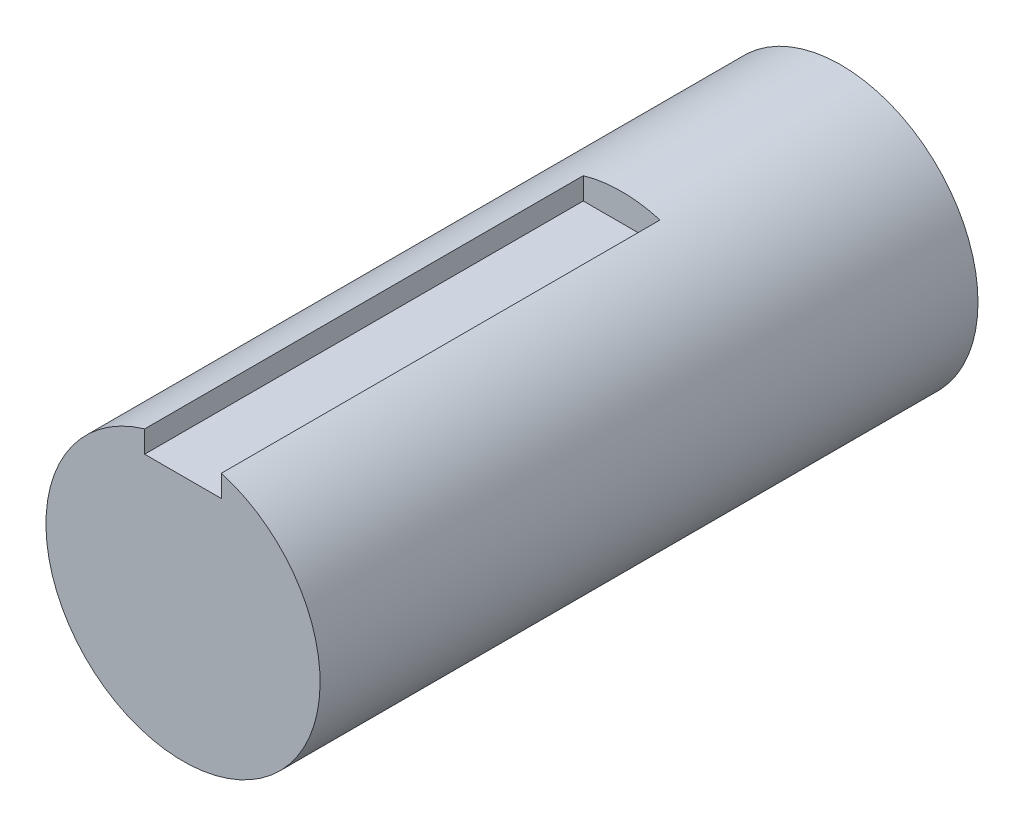
ISO-10303-21;
HEADER;
FILE_DESCRIPTION(('STEP AP214'),'2;1');
FILE_NAME('part.step','',(''),(''),'','','');
FILE_SCHEMA(('AUTOMOTIVE_DESIGN { 1 0 10303 214 1 1 1 1 }'));
ENDSEC;
DATA;
#1=APPLICATION_CONTEXT('core data for automotive mechanical design processes');
#2=APPLICATION_PROTOCOL_DEFINITION('international standard','automotive_design',2000,#1);
#3=PRODUCT_CONTEXT('',#1,'mechanical');
#4=PRODUCT('Part','Part','',(#3));
#5=PRODUCT_RELATED_PRODUCT_CATEGORY('part','',(#4));
#6=PRODUCT_DEFINITION_FORMATION('','',#4);
#7=PRODUCT_DEFINITION_CONTEXT('part definition',#1,'design');
#8=PRODUCT_DEFINITION('design','',#6,#7);
#9=PRODUCT_DEFINITION_SHAPE('','',#8);
#10=(LENGTH_UNIT() NAMED_UNIT(*) SI_UNIT(.MILLI.,.METRE.));
#11=(NAMED_UNIT(*) PLANE_ANGLE_UNIT() SI_UNIT($,.RADIAN.));
#12=(NAMED_UNIT(*) SI_UNIT($,.STERADIAN.) SOLID_ANGLE_UNIT());
#13=UNCERTAINTY_MEASURE_WITH_UNIT(LENGTH_MEASURE(1.E-05),#10,'distance_accuracy_value','');
#14=(GEOMETRIC_REPRESENTATION_CONTEXT(3) GLOBAL_UNCERTAINTY_ASSIGNED_CONTEXT((#13)) GLOBAL_UNIT_ASSIGNED_CONTEXT((#10,
#11,#12)) REPRESENTATION_CONTEXT('',''));
#15=CARTESIAN_POINT('',(0.,0.,0.));
#16=DIRECTION('',(0.,0.,1.));
#17=DIRECTION('',(1.,0.,0.));
#18=AXIS2_PLACEMENT_3D('',#15,#16,#17);
#19=CARTESIAN_POINT('',(0.,0.,60.));
#20=DIRECTION('',(0.,0.,-1.));
#21=DIRECTION('',(-1.,0.,0.));
#22=AXIS2_PLACEMENT_3D('',#19,#20,#21);
#23=CYLINDRICAL_SURFACE('',#22,25.);
#24=CARTESIAN_POINT('',(0.,0.,-20.));
#25=DIRECTION('',(0.,0.,1.));
#26=DIRECTION('',(1.,0.,0.));
#27=AXIS2_PLACEMENT_3D('',#24,#25,#26);
#28=CIRCLE('',#27,25.);
#29=CARTESIAN_POINT('',(7.,24.,-20.));
#30=VERTEX_POINT('',#29);
#31=CARTESIAN_POINT('',(-7.,24.,-20.));
#32=VERTEX_POINT('',#31);
#33=EDGE_CURVE('E11',#30,#32,#28,.T.);
#34=ORIENTED_EDGE('',*,*,#33,.F.);
#35=DIRECTION('',(0.,0.,-1.));
#36=VECTOR('',#35,1.);
#37=CARTESIAN_POINT('',(7.,24.,60.));
#38=LINE('',#37,#36);
#39=CARTESIAN_POINT('',(7.,24.,60.));
#40=VERTEX_POINT('',#39);
#41=EDGE_CURVE('E59',#30,#40,#38,.F.);
#42=ORIENTED_EDGE('',*,*,#41,.T.);
#43=CARTESIAN_POINT('',(0.,0.,60.));
#44=DIRECTION('',(0.,0.,1.));
#45=DIRECTION('',(1.,0.,0.));
#46=AXIS2_PLACEMENT_3D('',#43,#44,#45);
#47=CIRCLE('',#46,25.);
#48=CARTESIAN_POINT('',(-7.,24.,60.));
#49=VERTEX_POINT('',#48);
#50=EDGE_CURVE('E105',#49,#40,#47,.T.);
#51=ORIENTED_EDGE('',*,*,#50,.F.);
#52=DIRECTION('',(0.,0.,-1.));
#53=VECTOR('',#52,1.);
#54=CARTESIAN_POINT('',(-7.,24.,60.));
#55=LINE('',#54,#53);
#56=EDGE_CURVE('E51',#49,#32,#55,.T.);
#57=ORIENTED_EDGE('',*,*,#56,.T.);
#58=EDGE_LOOP('',(#34,#42,#51,#57));
#59=FACE_BOUND('',#58,.T.);
#60=CARTESIAN_POINT('',(0.,0.,-60.));
#61=DIRECTION('',(0.,0.,1.));
#62=DIRECTION('',(1.,0.,0.));
#63=AXIS2_PLACEMENT_3D('',#60,#61,#62);
#64=CIRCLE('',#63,25.);
#65=CARTESIAN_POINT('',(25.,0.,-60.));
#66=VERTEX_POINT('',#65);
#67=EDGE_CURVE('E104',#66,#66,#64,.T.);
#68=ORIENTED_EDGE('',*,*,#67,.T.);
#69=EDGE_LOOP('',(#68));
#70=FACE_BOUND('',#69,.T.);
#71=ADVANCED_FACE('F37',(#59,#70),#23,.T.);
#72=CARTESIAN_POINT('',(0.,0.,60.));
#73=DIRECTION('',(0.,0.,1.));
#74=DIRECTION('',(1.,0.,0.));
#75=AXIS2_PLACEMENT_3D('',#72,#73,#74);
#76=PLANE('',#75);
#77=DIRECTION('',(0.,1.,0.));
#78=VECTOR('',#77,1.);
#79=CARTESIAN_POINT('',(7.,30.,60.));
#80=LINE('',#79,#78);
#81=CARTESIAN_POINT('',(7.,20.,60.));
#82=VERTEX_POINT('',#81);
#83=EDGE_CURVE('E97',#82,#40,#80,.T.);
#84=ORIENTED_EDGE('',*,*,#83,.F.);
#85=DIRECTION('',(1.,0.,0.));
#86=VECTOR('',#85,1.);
#87=CARTESIAN_POINT('',(-7.,20.,60.));
#88=LINE('',#87,#86);
#89=CARTESIAN_POINT('',(-7.,20.,60.));
#90=VERTEX_POINT('',#89);
#91=EDGE_CURVE('E99',#90,#82,#88,.T.);
#92=ORIENTED_EDGE('',*,*,#91,.F.);
#93=DIRECTION('',(0.,-1.,0.));
#94=VECTOR('',#93,1.);
#95=CARTESIAN_POINT('',(-7.,0.,60.));
#96=LINE('',#95,#94);
#97=EDGE_CURVE('E44',#49,#90,#96,.T.);
#98=ORIENTED_EDGE('',*,*,#97,.F.);
#99=ORIENTED_EDGE('',*,*,#50,.T.);
#100=EDGE_LOOP('',(#84,#92,#98,#99));
#101=FACE_BOUND('',#100,.T.);
#102=ADVANCED_FACE('F114',(#101),#76,.T.);
#103=CARTESIAN_POINT('',(0.,0.,-60.));
#104=DIRECTION('',(0.,0.,1.));
#105=DIRECTION('',(1.,0.,0.));
#106=AXIS2_PLACEMENT_3D('',#103,#104,#105);
#107=PLANE('',#106);
#108=ORIENTED_EDGE('',*,*,#67,.F.);
#109=EDGE_LOOP('',(#108));
#110=FACE_BOUND('',#109,.T.);
#111=ADVANCED_FACE('F112',(#110),#107,.F.);
#112=CARTESIAN_POINT('',(0.,0.,-20.));
#113=DIRECTION('',(0.,0.,1.));
#114=DIRECTION('',(1.,0.,0.));
#115=AXIS2_PLACEMENT_3D('',#112,#113,#114);
#116=PLANE('',#115);
#117=ORIENTED_EDGE('',*,*,#33,.T.);
#118=DIRECTION('',(0.,-1.,0.));
#119=VECTOR('',#118,1.);
#120=CARTESIAN_POINT('',(-7.,30.,-20.));
#121=LINE('',#120,#119);
#122=CARTESIAN_POINT('',(-7.,20.,-20.));
#123=VERTEX_POINT('',#122);
#124=EDGE_CURVE('E77',#32,#123,#121,.T.);
#125=ORIENTED_EDGE('',*,*,#124,.T.);
#126=DIRECTION('',(1.,0.,0.));
#127=VECTOR('',#126,1.);
#128=CARTESIAN_POINT('',(-7.,20.,-20.));
#129=LINE('',#128,#127);
#130=CARTESIAN_POINT('',(7.,20.,-20.));
#131=VERTEX_POINT('',#130);
#132=EDGE_CURVE('E81',#123,#131,#129,.T.);
#133=ORIENTED_EDGE('',*,*,#132,.T.);
#134=DIRECTION('',(0.,1.,0.));
#135=VECTOR('',#134,1.);
#136=CARTESIAN_POINT('',(7.,30.,-20.));
#137=LINE('',#136,#135);
#138=EDGE_CURVE('E83',#131,#30,#137,.T.);
#139=ORIENTED_EDGE('',*,*,#138,.T.);
#140=EDGE_LOOP('',(#117,#125,#133,#139));
#141=FACE_BOUND('',#140,.T.);
#142=ADVANCED_FACE('F79',(#141),#116,.T.);
#143=CARTESIAN_POINT('',(7.,30.,-20.));
#144=DIRECTION('',(1.,0.,0.));
#145=DIRECTION('',(0.,0.,-1.));
#146=AXIS2_PLACEMENT_3D('',#143,#144,#145);
#147=PLANE('',#146);
#148=ORIENTED_EDGE('',*,*,#138,.F.);
#149=DIRECTION('',(0.,0.,1.));
#150=VECTOR('',#149,1.);
#151=CARTESIAN_POINT('',(7.,20.,-20.));
#152=LINE('',#151,#150);
#153=EDGE_CURVE('E91',#131,#82,#152,.T.);
#154=ORIENTED_EDGE('',*,*,#153,.T.);
#155=ORIENTED_EDGE('',*,*,#83,.T.);
#156=ORIENTED_EDGE('',*,*,#41,.F.);
#157=EDGE_LOOP('',(#148,#154,#155,#156));
#158=FACE_BOUND('',#157,.T.);
#159=ADVANCED_FACE('F119',(#158),#147,.F.);
#160=CARTESIAN_POINT('',(-7.,30.,-20.));
#161=DIRECTION('',(-1.,0.,0.));
#162=DIRECTION('',(0.,-1.,0.));
#163=AXIS2_PLACEMENT_3D('',#160,#161,#162);
#164=PLANE('',#163);
#165=ORIENTED_EDGE('',*,*,#97,.T.);
#166=DIRECTION('',(0.,0.,1.));
#167=VECTOR('',#166,1.);
#168=CARTESIAN_POINT('',(-7.,20.,-20.));
#169=LINE('',#168,#167);
#170=EDGE_CURVE('E86',#123,#90,#169,.T.);
#171=ORIENTED_EDGE('',*,*,#170,.F.);
#172=ORIENTED_EDGE('',*,*,#124,.F.);
#173=ORIENTED_EDGE('',*,*,#56,.F.);
#174=EDGE_LOOP('',(#165,#171,#172,#173));
#175=FACE_BOUND('',#174,.T.);
#176=ADVANCED_FACE('F87',(#175),#164,.F.);
#177=CARTESIAN_POINT('',(-7.,20.,-20.));
#178=DIRECTION('',(0.,-1.,0.));
#179=DIRECTION('',(0.,0.,-1.));
#180=AXIS2_PLACEMENT_3D('',#177,#178,#179);
#181=PLANE('',#180);
#182=ORIENTED_EDGE('',*,*,#91,.T.);
#183=ORIENTED_EDGE('',*,*,#153,.F.);
#184=ORIENTED_EDGE('',*,*,#132,.F.);
#185=ORIENTED_EDGE('',*,*,#170,.T.);
#186=EDGE_LOOP('',(#182,#183,#184,#185));
#187=FACE_BOUND('',#186,.T.);
#188=ADVANCED_FACE('F93',(#187),#181,.F.);
#189=CLOSED_SHELL('',(#71,#102,#111,#142,#159,#176,#188));
#190=MANIFOLD_SOLID_BREP('B2',#189);
#191=ADVANCED_BREP_SHAPE_REPRESENTATION('',(#18,#190),#14);
#192=SHAPE_DEFINITION_REPRESENTATION(#9,#191);
ENDSEC;
END-ISO-10303-21;
